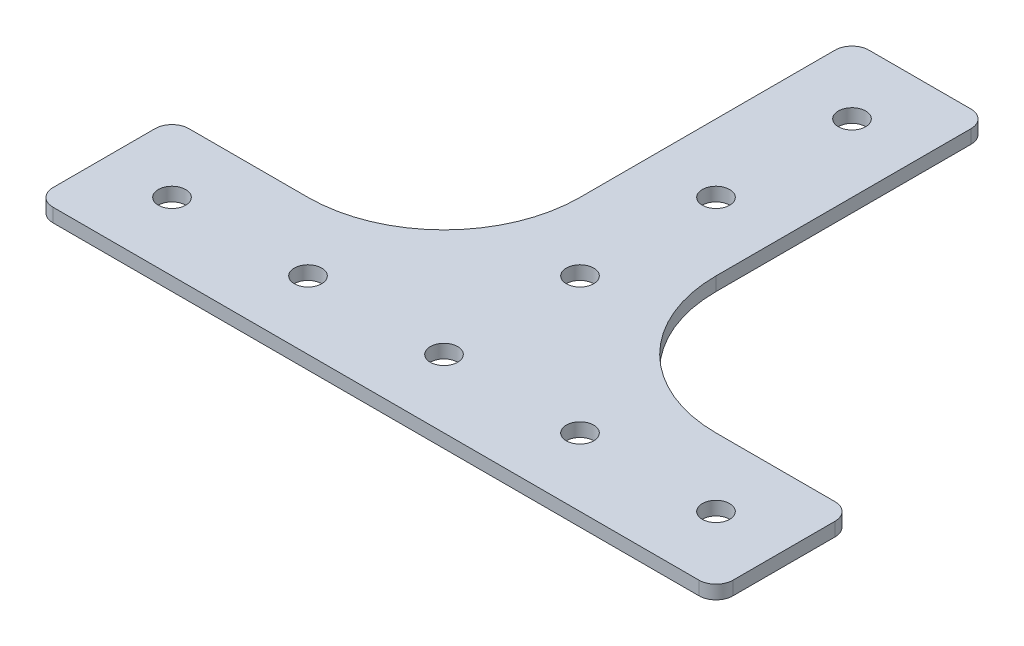
ISO-10303-21;
HEADER;
FILE_DESCRIPTION(('STEP AP214'),'2;1');
FILE_NAME('part.step','',(''),(''),'','','');
FILE_SCHEMA(('AUTOMOTIVE_DESIGN { 1 0 10303 214 1 1 1 1 }'));
ENDSEC;
DATA;
#1=APPLICATION_CONTEXT('core data for automotive mechanical design processes');
#2=APPLICATION_PROTOCOL_DEFINITION('international standard','automotive_design',2000,#1);
#3=PRODUCT_CONTEXT('',#1,'mechanical');
#4=PRODUCT('Part','Part','',(#3));
#5=PRODUCT_RELATED_PRODUCT_CATEGORY('part','',(#4));
#6=PRODUCT_DEFINITION_FORMATION('','',#4);
#7=PRODUCT_DEFINITION_CONTEXT('part definition',#1,'design');
#8=PRODUCT_DEFINITION('design','',#6,#7);
#9=PRODUCT_DEFINITION_SHAPE('','',#8);
#10=(LENGTH_UNIT() NAMED_UNIT(*) SI_UNIT(.MILLI.,.METRE.));
#11=(NAMED_UNIT(*) PLANE_ANGLE_UNIT() SI_UNIT($,.RADIAN.));
#12=(NAMED_UNIT(*) SI_UNIT($,.STERADIAN.) SOLID_ANGLE_UNIT());
#13=UNCERTAINTY_MEASURE_WITH_UNIT(LENGTH_MEASURE(1.E-05),#10,'distance_accuracy_value','');
#14=(GEOMETRIC_REPRESENTATION_CONTEXT(3) GLOBAL_UNCERTAINTY_ASSIGNED_CONTEXT((#13)) GLOBAL_UNIT_ASSIGNED_CONTEXT((#10,
#11,#12)) REPRESENTATION_CONTEXT('',''));
#15=CARTESIAN_POINT('',(0.,0.,0.));
#16=DIRECTION('',(0.,0.,1.));
#17=DIRECTION('',(1.,0.,0.));
#18=AXIS2_PLACEMENT_3D('',#15,#16,#17);
#19=CARTESIAN_POINT('',(-12.7,2.54,-25.4));
#20=DIRECTION('',(1.,0.,0.));
#21=DIRECTION('',(0.,0.,-1.));
#22=AXIS2_PLACEMENT_3D('',#19,#20,#21);
#23=PLANE('',#22);
#24=DIRECTION('',(0.,0.,1.));
#25=VECTOR('',#24,1.);
#26=CARTESIAN_POINT('',(-12.7,0.,-25.4));
#27=LINE('',#26,#25);
#28=CARTESIAN_POINT('',(-12.7,0.,-98.425));
#29=VERTEX_POINT('',#28);
#30=CARTESIAN_POINT('',(-12.7,0.,-50.8));
#31=VERTEX_POINT('',#30);
#32=EDGE_CURVE('E357',#29,#31,#27,.T.);
#33=ORIENTED_EDGE('',*,*,#32,.T.);
#34=DIRECTION('',(0.,-1.,0.));
#35=VECTOR('',#34,1.);
#36=CARTESIAN_POINT('',(-12.7,2.54,-50.8));
#37=LINE('',#36,#35);
#38=CARTESIAN_POINT('',(-12.7,2.54,-50.8));
#39=VERTEX_POINT('',#38);
#40=EDGE_CURVE('E267',#31,#39,#37,.F.);
#41=ORIENTED_EDGE('',*,*,#40,.T.);
#42=DIRECTION('',(0.,0.,1.));
#43=VECTOR('',#42,1.);
#44=CARTESIAN_POINT('',(-12.7,2.54,-25.4));
#45=LINE('',#44,#43);
#46=CARTESIAN_POINT('',(-12.7,2.54,-98.425));
#47=VERTEX_POINT('',#46);
#48=EDGE_CURVE('E190',#47,#39,#45,.T.);
#49=ORIENTED_EDGE('',*,*,#48,.F.);
#50=DIRECTION('',(0.,-1.,0.));
#51=VECTOR('',#50,1.);
#52=CARTESIAN_POINT('',(-12.7,2.54,-98.425));
#53=LINE('',#52,#51);
#54=EDGE_CURVE('E241',#47,#29,#53,.T.);
#55=ORIENTED_EDGE('',*,*,#54,.T.);
#56=EDGE_LOOP('',(#33,#41,#49,#55));
#57=FACE_BOUND('',#56,.T.);
#58=ADVANCED_FACE('F41',(#57),#23,.F.);
#59=CARTESIAN_POINT('',(-63.5,2.54,-25.4));
#60=DIRECTION('',(0.,0.,1.));
#61=DIRECTION('',(1.,0.,0.));
#62=AXIS2_PLACEMENT_3D('',#59,#60,#61);
#63=PLANE('',#62);
#64=DIRECTION('',(-1.,0.,0.));
#65=VECTOR('',#64,1.);
#66=CARTESIAN_POINT('',(-63.5,2.54,-25.4));
#67=LINE('',#66,#65);
#68=CARTESIAN_POINT('',(-38.1,2.54,-25.4));
#69=VERTEX_POINT('',#68);
#70=CARTESIAN_POINT('',(-60.325,2.54,-25.4));
#71=VERTEX_POINT('',#70);
#72=EDGE_CURVE('E340',#69,#71,#67,.T.);
#73=ORIENTED_EDGE('',*,*,#72,.F.);
#74=DIRECTION('',(0.,-1.,0.));
#75=VECTOR('',#74,1.);
#76=CARTESIAN_POINT('',(-38.1,0.,-25.4));
#77=LINE('',#76,#75);
#78=CARTESIAN_POINT('',(-38.1,0.,-25.4));
#79=VERTEX_POINT('',#78);
#80=EDGE_CURVE('E263',#69,#79,#77,.T.);
#81=ORIENTED_EDGE('',*,*,#80,.T.);
#82=DIRECTION('',(-1.,0.,0.));
#83=VECTOR('',#82,1.);
#84=CARTESIAN_POINT('',(-63.5,0.,-25.4));
#85=LINE('',#84,#83);
#86=CARTESIAN_POINT('',(-60.325,0.,-25.4));
#87=VERTEX_POINT('',#86);
#88=EDGE_CURVE('E361',#79,#87,#85,.T.);
#89=ORIENTED_EDGE('',*,*,#88,.T.);
#90=DIRECTION('',(0.,-1.,0.));
#91=VECTOR('',#90,1.);
#92=CARTESIAN_POINT('',(-60.325,2.54,-25.4));
#93=LINE('',#92,#91);
#94=EDGE_CURVE('E237',#87,#71,#93,.F.);
#95=ORIENTED_EDGE('',*,*,#94,.T.);
#96=EDGE_LOOP('',(#73,#81,#89,#95));
#97=FACE_BOUND('',#96,.T.);
#98=ADVANCED_FACE('F395',(#97),#63,.F.);
#99=CARTESIAN_POINT('',(-63.5,2.54,0.));
#100=DIRECTION('',(1.,0.,0.));
#101=DIRECTION('',(0.,0.,-1.));
#102=AXIS2_PLACEMENT_3D('',#99,#100,#101);
#103=PLANE('',#102);
#104=DIRECTION('',(0.,0.,1.));
#105=VECTOR('',#104,1.);
#106=CARTESIAN_POINT('',(-63.5,2.54,0.));
#107=LINE('',#106,#105);
#108=CARTESIAN_POINT('',(-63.5,2.54,-22.225));
#109=VERTEX_POINT('',#108);
#110=CARTESIAN_POINT('',(-63.5,2.54,-3.175));
#111=VERTEX_POINT('',#110);
#112=EDGE_CURVE('E335',#109,#111,#107,.T.);
#113=ORIENTED_EDGE('',*,*,#112,.F.);
#114=DIRECTION('',(0.,-1.,0.));
#115=VECTOR('',#114,1.);
#116=CARTESIAN_POINT('',(-63.5,2.54,-22.225));
#117=LINE('',#116,#115);
#118=CARTESIAN_POINT('',(-63.5,0.,-22.225));
#119=VERTEX_POINT('',#118);
#120=EDGE_CURVE('E233',#109,#119,#117,.T.);
#121=ORIENTED_EDGE('',*,*,#120,.T.);
#122=DIRECTION('',(0.,0.,1.));
#123=VECTOR('',#122,1.);
#124=CARTESIAN_POINT('',(-63.5,0.,0.));
#125=LINE('',#124,#123);
#126=CARTESIAN_POINT('',(-63.5,0.,-3.175));
#127=VERTEX_POINT('',#126);
#128=EDGE_CURVE('E364',#119,#127,#125,.T.);
#129=ORIENTED_EDGE('',*,*,#128,.T.);
#130=DIRECTION('',(0.,-1.,0.));
#131=VECTOR('',#130,1.);
#132=CARTESIAN_POINT('',(-63.5,2.54,-3.175));
#133=LINE('',#132,#131);
#134=EDGE_CURVE('E230',#127,#111,#133,.F.);
#135=ORIENTED_EDGE('',*,*,#134,.T.);
#136=EDGE_LOOP('',(#113,#121,#129,#135));
#137=FACE_BOUND('',#136,.T.);
#138=ADVANCED_FACE('F392',(#137),#103,.F.);
#139=CARTESIAN_POINT('',(-63.5,2.54,0.));
#140=DIRECTION('',(0.,0.,-1.));
#141=DIRECTION('',(-1.,0.,0.));
#142=AXIS2_PLACEMENT_3D('',#139,#140,#141);
#143=PLANE('',#142);
#144=DIRECTION('',(1.,0.,0.));
#145=VECTOR('',#144,1.);
#146=CARTESIAN_POINT('',(-63.5,0.,0.));
#147=LINE('',#146,#145);
#148=CARTESIAN_POINT('',(-60.325,0.,0.));
#149=VERTEX_POINT('',#148);
#150=CARTESIAN_POINT('',(60.325,0.,0.));
#151=VERTEX_POINT('',#150);
#152=EDGE_CURVE('E184',#149,#151,#147,.T.);
#153=ORIENTED_EDGE('',*,*,#152,.T.);
#154=DIRECTION('',(0.,-1.,0.));
#155=VECTOR('',#154,1.);
#156=CARTESIAN_POINT('',(60.325,2.54,0.));
#157=LINE('',#156,#155);
#158=CARTESIAN_POINT('',(60.325,2.54,0.));
#159=VERTEX_POINT('',#158);
#160=EDGE_CURVE('E260',#151,#159,#157,.F.);
#161=ORIENTED_EDGE('',*,*,#160,.T.);
#162=DIRECTION('',(1.,0.,0.));
#163=VECTOR('',#162,1.);
#164=CARTESIAN_POINT('',(-63.5,2.54,0.));
#165=LINE('',#164,#163);
#166=CARTESIAN_POINT('',(-60.325,2.54,0.));
#167=VERTEX_POINT('',#166);
#168=EDGE_CURVE('E330',#167,#159,#165,.T.);
#169=ORIENTED_EDGE('',*,*,#168,.F.);
#170=DIRECTION('',(0.,-1.,0.));
#171=VECTOR('',#170,1.);
#172=CARTESIAN_POINT('',(-60.325,2.54,0.));
#173=LINE('',#172,#171);
#174=EDGE_CURVE('E256',#167,#149,#173,.T.);
#175=ORIENTED_EDGE('',*,*,#174,.T.);
#176=EDGE_LOOP('',(#153,#161,#169,#175));
#177=FACE_BOUND('',#176,.T.);
#178=ADVANCED_FACE('F373',(#177),#143,.F.);
#179=CARTESIAN_POINT('',(63.5,2.54,-25.4));
#180=DIRECTION('',(-1.,0.,0.));
#181=DIRECTION('',(0.,0.,1.));
#182=AXIS2_PLACEMENT_3D('',#179,#180,#181);
#183=PLANE('',#182);
#184=DIRECTION('',(0.,0.,-1.));
#185=VECTOR('',#184,1.);
#186=CARTESIAN_POINT('',(63.5,0.,-25.4));
#187=LINE('',#186,#185);
#188=CARTESIAN_POINT('',(63.5,0.,-3.17500000000003));
#189=VERTEX_POINT('',#188);
#190=CARTESIAN_POINT('',(63.5,0.,-22.225));
#191=VERTEX_POINT('',#190);
#192=EDGE_CURVE('E177',#189,#191,#187,.T.);
#193=ORIENTED_EDGE('',*,*,#192,.T.);
#194=DIRECTION('',(0.,-1.,0.));
#195=VECTOR('',#194,1.);
#196=CARTESIAN_POINT('',(63.5,2.54,-22.225));
#197=LINE('',#196,#195);
#198=CARTESIAN_POINT('',(63.5,2.54,-22.225));
#199=VERTEX_POINT('',#198);
#200=EDGE_CURVE('E160',#191,#199,#197,.F.);
#201=ORIENTED_EDGE('',*,*,#200,.T.);
#202=DIRECTION('',(0.,0.,-1.));
#203=VECTOR('',#202,1.);
#204=CARTESIAN_POINT('',(63.5,2.54,-25.4));
#205=LINE('',#204,#203);
#206=CARTESIAN_POINT('',(63.5,2.54,-3.17500000000003));
#207=VERTEX_POINT('',#206);
#208=EDGE_CURVE('E325',#207,#199,#205,.T.);
#209=ORIENTED_EDGE('',*,*,#208,.F.);
#210=DIRECTION('',(0.,-1.,0.));
#211=VECTOR('',#210,1.);
#212=CARTESIAN_POINT('',(63.5,2.54,-3.17500000000003));
#213=LINE('',#212,#211);
#214=EDGE_CURVE('E164',#207,#189,#213,.T.);
#215=ORIENTED_EDGE('',*,*,#214,.T.);
#216=EDGE_LOOP('',(#193,#201,#209,#215));
#217=FACE_BOUND('',#216,.T.);
#218=ADVANCED_FACE('F383',(#217),#183,.F.);
#219=CARTESIAN_POINT('',(12.7,2.54,-25.4));
#220=DIRECTION('',(0.,0.,1.));
#221=DIRECTION('',(1.,0.,0.));
#222=AXIS2_PLACEMENT_3D('',#219,#220,#221);
#223=PLANE('',#222);
#224=DIRECTION('',(-1.,0.,0.));
#225=VECTOR('',#224,1.);
#226=CARTESIAN_POINT('',(12.7,0.,-25.4));
#227=LINE('',#226,#225);
#228=CARTESIAN_POINT('',(60.325,0.,-25.4));
#229=VERTEX_POINT('',#228);
#230=CARTESIAN_POINT('',(38.1,0.,-25.4));
#231=VERTEX_POINT('',#230);
#232=EDGE_CURVE('E168',#229,#231,#227,.T.);
#233=ORIENTED_EDGE('',*,*,#232,.T.);
#234=DIRECTION('',(0.,-1.,0.));
#235=VECTOR('',#234,1.);
#236=CARTESIAN_POINT('',(38.1,2.54,-25.4));
#237=LINE('',#236,#235);
#238=CARTESIAN_POINT('',(38.1,2.54,-25.4));
#239=VERTEX_POINT('',#238);
#240=EDGE_CURVE('E63',#231,#239,#237,.F.);
#241=ORIENTED_EDGE('',*,*,#240,.T.);
#242=DIRECTION('',(-1.,0.,0.));
#243=VECTOR('',#242,1.);
#244=CARTESIAN_POINT('',(12.7,2.54,-25.4));
#245=LINE('',#244,#243);
#246=CARTESIAN_POINT('',(60.325,2.54,-25.4));
#247=VERTEX_POINT('',#246);
#248=EDGE_CURVE('E169',#247,#239,#245,.T.);
#249=ORIENTED_EDGE('',*,*,#248,.F.);
#250=DIRECTION('',(0.,-1.,0.));
#251=VECTOR('',#250,1.);
#252=CARTESIAN_POINT('',(60.325,2.54,-25.4));
#253=LINE('',#252,#251);
#254=EDGE_CURVE('E159',#247,#229,#253,.T.);
#255=ORIENTED_EDGE('',*,*,#254,.T.);
#256=EDGE_LOOP('',(#233,#241,#249,#255));
#257=FACE_BOUND('',#256,.T.);
#258=ADVANCED_FACE('F167',(#257),#223,.F.);
#259=CARTESIAN_POINT('',(12.7,2.54,-101.6));
#260=DIRECTION('',(-1.,0.,0.));
#261=DIRECTION('',(0.,0.,1.));
#262=AXIS2_PLACEMENT_3D('',#259,#260,#261);
#263=PLANE('',#262);
#264=DIRECTION('',(0.,0.,-1.));
#265=VECTOR('',#264,1.);
#266=CARTESIAN_POINT('',(12.7,2.54,-101.6));
#267=LINE('',#266,#265);
#268=CARTESIAN_POINT('',(12.7,2.54,-50.8));
#269=VERTEX_POINT('',#268);
#270=CARTESIAN_POINT('',(12.7,2.54,-98.425));
#271=VERTEX_POINT('',#270);
#272=EDGE_CURVE('E318',#269,#271,#267,.T.);
#273=ORIENTED_EDGE('',*,*,#272,.F.);
#274=DIRECTION('',(0.,-1.,0.));
#275=VECTOR('',#274,1.);
#276=CARTESIAN_POINT('',(12.7,0.,-50.8));
#277=LINE('',#276,#275);
#278=CARTESIAN_POINT('',(12.7,0.,-50.8));
#279=VERTEX_POINT('',#278);
#280=EDGE_CURVE('E270',#269,#279,#277,.T.);
#281=ORIENTED_EDGE('',*,*,#280,.T.);
#282=DIRECTION('',(0.,0.,-1.));
#283=VECTOR('',#282,1.);
#284=CARTESIAN_POINT('',(12.7,0.,-101.6));
#285=LINE('',#284,#283);
#286=CARTESIAN_POINT('',(12.7,0.,-98.425));
#287=VERTEX_POINT('',#286);
#288=EDGE_CURVE('E176',#279,#287,#285,.T.);
#289=ORIENTED_EDGE('',*,*,#288,.T.);
#290=DIRECTION('',(0.,-1.,0.));
#291=VECTOR('',#290,1.);
#292=CARTESIAN_POINT('',(12.7,2.54,-98.425));
#293=LINE('',#292,#291);
#294=EDGE_CURVE('E252',#287,#271,#293,.F.);
#295=ORIENTED_EDGE('',*,*,#294,.T.);
#296=EDGE_LOOP('',(#273,#281,#289,#295));
#297=FACE_BOUND('',#296,.T.);
#298=ADVANCED_FACE('F390',(#297),#263,.F.);
#299=CARTESIAN_POINT('',(-12.7,2.54,-101.6));
#300=DIRECTION('',(0.,0.,1.));
#301=DIRECTION('',(1.,0.,0.));
#302=AXIS2_PLACEMENT_3D('',#299,#300,#301);
#303=PLANE('',#302);
#304=DIRECTION('',(-1.,0.,0.));
#305=VECTOR('',#304,1.);
#306=CARTESIAN_POINT('',(-12.7,0.,-101.6));
#307=LINE('',#306,#305);
#308=CARTESIAN_POINT('',(9.52499999999998,0.,-101.6));
#309=VERTEX_POINT('',#308);
#310=CARTESIAN_POINT('',(-9.52500000000002,0.,-101.6));
#311=VERTEX_POINT('',#310);
#312=EDGE_CURVE('E182',#309,#311,#307,.T.);
#313=ORIENTED_EDGE('',*,*,#312,.T.);
#314=DIRECTION('',(0.,-1.,0.));
#315=VECTOR('',#314,1.);
#316=CARTESIAN_POINT('',(-9.52500000000002,2.54,-101.6));
#317=LINE('',#316,#315);
#318=CARTESIAN_POINT('',(-9.52500000000002,2.54,-101.6));
#319=VERTEX_POINT('',#318);
#320=EDGE_CURVE('E249',#311,#319,#317,.F.);
#321=ORIENTED_EDGE('',*,*,#320,.T.);
#322=DIRECTION('',(-1.,0.,0.));
#323=VECTOR('',#322,1.);
#324=CARTESIAN_POINT('',(-12.7,2.54,-101.6));
#325=LINE('',#324,#323);
#326=CARTESIAN_POINT('',(9.52499999999998,2.54,-101.6));
#327=VERTEX_POINT('',#326);
#328=EDGE_CURVE('E172',#327,#319,#325,.T.);
#329=ORIENTED_EDGE('',*,*,#328,.F.);
#330=DIRECTION('',(0.,-1.,0.));
#331=VECTOR('',#330,1.);
#332=CARTESIAN_POINT('',(9.52499999999998,2.54,-101.6));
#333=LINE('',#332,#331);
#334=EDGE_CURVE('E245',#327,#309,#333,.T.);
#335=ORIENTED_EDGE('',*,*,#334,.T.);
#336=EDGE_LOOP('',(#313,#321,#329,#335));
#337=FACE_BOUND('',#336,.T.);
#338=ADVANCED_FACE('F455',(#337),#303,.F.);
#339=CARTESIAN_POINT('',(0.,2.54,0.));
#340=DIRECTION('',(0.,-1.,0.));
#341=DIRECTION('',(0.,0.,-1.));
#342=AXIS2_PLACEMENT_3D('',#339,#340,#341);
#343=PLANE('',#342);
#344=CARTESIAN_POINT('',(0.,2.54,-12.7));
#345=DIRECTION('',(0.,1.,0.));
#346=DIRECTION('',(0.,0.,1.));
#347=AXIS2_PLACEMENT_3D('',#344,#345,#346);
#348=CIRCLE('',#347,2.55269999999999);
#349=CARTESIAN_POINT('',(0.,2.54,-10.1473));
#350=VERTEX_POINT('',#349);
#351=EDGE_CURVE('E521',#350,#350,#348,.T.);
#352=ORIENTED_EDGE('',*,*,#351,.F.);
#353=EDGE_LOOP('',(#352));
#354=FACE_BOUND('',#353,.T.);
#355=CARTESIAN_POINT('',(25.4,2.54,-12.7));
#356=DIRECTION('',(0.,1.,0.));
#357=DIRECTION('',(0.,0.,1.));
#358=AXIS2_PLACEMENT_3D('',#355,#356,#357);
#359=CIRCLE('',#358,2.55269999999999);
#360=CARTESIAN_POINT('',(25.4,2.54,-10.1473));
#361=VERTEX_POINT('',#360);
#362=EDGE_CURVE('E510',#361,#361,#359,.T.);
#363=ORIENTED_EDGE('',*,*,#362,.F.);
#364=EDGE_LOOP('',(#363));
#365=FACE_BOUND('',#364,.T.);
#366=CARTESIAN_POINT('',(50.8,2.54,-12.7));
#367=DIRECTION('',(0.,1.,0.));
#368=DIRECTION('',(0.,0.,1.));
#369=AXIS2_PLACEMENT_3D('',#366,#367,#368);
#370=CIRCLE('',#369,2.55269999999999);
#371=CARTESIAN_POINT('',(50.8,2.54,-10.1473));
#372=VERTEX_POINT('',#371);
#373=EDGE_CURVE('E518',#372,#372,#370,.T.);
#374=ORIENTED_EDGE('',*,*,#373,.F.);
#375=EDGE_LOOP('',(#374));
#376=FACE_BOUND('',#375,.T.);
#377=CARTESIAN_POINT('',(-25.4,2.54,-12.7));
#378=DIRECTION('',(0.,1.,0.));
#379=DIRECTION('',(0.,0.,1.));
#380=AXIS2_PLACEMENT_3D('',#377,#378,#379);
#381=CIRCLE('',#380,2.55269999999999);
#382=CARTESIAN_POINT('',(-25.4,2.54,-10.1473));
#383=VERTEX_POINT('',#382);
#384=EDGE_CURVE('E532',#383,#383,#381,.T.);
#385=ORIENTED_EDGE('',*,*,#384,.F.);
#386=EDGE_LOOP('',(#385));
#387=FACE_BOUND('',#386,.T.);
#388=CARTESIAN_POINT('',(-50.8,2.54,-12.7));
#389=DIRECTION('',(0.,1.,0.));
#390=DIRECTION('',(0.,0.,1.));
#391=AXIS2_PLACEMENT_3D('',#388,#389,#390);
#392=CIRCLE('',#391,2.55269999999999);
#393=CARTESIAN_POINT('',(-50.8,2.54,-10.1473));
#394=VERTEX_POINT('',#393);
#395=EDGE_CURVE('E540',#394,#394,#392,.T.);
#396=ORIENTED_EDGE('',*,*,#395,.F.);
#397=EDGE_LOOP('',(#396));
#398=FACE_BOUND('',#397,.T.);
#399=CARTESIAN_POINT('',(0.,2.54,-38.1));
#400=DIRECTION('',(0.,1.,0.));
#401=DIRECTION('',(0.,0.,1.));
#402=AXIS2_PLACEMENT_3D('',#399,#400,#401);
#403=CIRCLE('',#402,2.55269999999999);
#404=CARTESIAN_POINT('',(0.,2.54,-35.5473));
#405=VERTEX_POINT('',#404);
#406=EDGE_CURVE('E548',#405,#405,#403,.T.);
#407=ORIENTED_EDGE('',*,*,#406,.F.);
#408=EDGE_LOOP('',(#407));
#409=FACE_BOUND('',#408,.T.);
#410=CARTESIAN_POINT('',(0.,2.54,-63.5));
#411=DIRECTION('',(0.,1.,0.));
#412=DIRECTION('',(0.,0.,1.));
#413=AXIS2_PLACEMENT_3D('',#410,#411,#412);
#414=CIRCLE('',#413,2.55269999999999);
#415=CARTESIAN_POINT('',(0.,2.54,-60.9473));
#416=VERTEX_POINT('',#415);
#417=EDGE_CURVE('E556',#416,#416,#414,.T.);
#418=ORIENTED_EDGE('',*,*,#417,.F.);
#419=EDGE_LOOP('',(#418));
#420=FACE_BOUND('',#419,.T.);
#421=CARTESIAN_POINT('',(0.,2.54,-88.9));
#422=DIRECTION('',(0.,1.,0.));
#423=DIRECTION('',(0.,0.,1.));
#424=AXIS2_PLACEMENT_3D('',#421,#422,#423);
#425=CIRCLE('',#424,2.55269999999999);
#426=CARTESIAN_POINT('',(0.,2.54,-86.3473));
#427=VERTEX_POINT('',#426);
#428=EDGE_CURVE('E563',#427,#427,#425,.T.);
#429=ORIENTED_EDGE('',*,*,#428,.F.);
#430=EDGE_LOOP('',(#429));
#431=FACE_BOUND('',#430,.T.);
#432=ORIENTED_EDGE('',*,*,#208,.T.);
#433=CARTESIAN_POINT('',(60.325,2.54,-22.225));
#434=DIRECTION('',(0.,-1.,0.));
#435=DIRECTION('',(0.,0.,-1.));
#436=AXIS2_PLACEMENT_3D('',#433,#434,#435);
#437=CIRCLE('',#436,3.175);
#438=EDGE_CURVE('E227',#199,#247,#437,.F.);
#439=ORIENTED_EDGE('',*,*,#438,.T.);
#440=ORIENTED_EDGE('',*,*,#248,.T.);
#441=CARTESIAN_POINT('',(38.1,2.54,-50.8));
#442=DIRECTION('',(0.,-1.,0.));
#443=DIRECTION('',(0.,0.,-1.));
#444=AXIS2_PLACEMENT_3D('',#441,#442,#443);
#445=CIRCLE('',#444,25.4);
#446=EDGE_CURVE('E11',#239,#269,#445,.T.);
#447=ORIENTED_EDGE('',*,*,#446,.T.);
#448=ORIENTED_EDGE('',*,*,#272,.T.);
#449=CARTESIAN_POINT('',(9.52499999999998,2.54,-98.425));
#450=DIRECTION('',(0.,-1.,0.));
#451=DIRECTION('',(0.,0.,-1.));
#452=AXIS2_PLACEMENT_3D('',#449,#450,#451);
#453=CIRCLE('',#452,3.175);
#454=EDGE_CURVE('E218',#271,#327,#453,.F.);
#455=ORIENTED_EDGE('',*,*,#454,.T.);
#456=ORIENTED_EDGE('',*,*,#328,.T.);
#457=CARTESIAN_POINT('',(-9.52500000000002,2.54,-98.425));
#458=DIRECTION('',(0.,-1.,0.));
#459=DIRECTION('',(0.,0.,-1.));
#460=AXIS2_PLACEMENT_3D('',#457,#458,#459);
#461=CIRCLE('',#460,3.175);
#462=EDGE_CURVE('E221',#319,#47,#461,.F.);
#463=ORIENTED_EDGE('',*,*,#462,.T.);
#464=ORIENTED_EDGE('',*,*,#48,.T.);
#465=CARTESIAN_POINT('',(-38.1,2.54,-50.8));
#466=DIRECTION('',(0.,-1.,0.));
#467=DIRECTION('',(0.,0.,-1.));
#468=AXIS2_PLACEMENT_3D('',#465,#466,#467);
#469=CIRCLE('',#468,25.4);
#470=EDGE_CURVE('E279',#39,#69,#469,.T.);
#471=ORIENTED_EDGE('',*,*,#470,.T.);
#472=ORIENTED_EDGE('',*,*,#72,.T.);
#473=CARTESIAN_POINT('',(-60.325,2.54,-22.225));
#474=DIRECTION('',(0.,-1.,0.));
#475=DIRECTION('',(0.,0.,-1.));
#476=AXIS2_PLACEMENT_3D('',#473,#474,#475);
#477=CIRCLE('',#476,3.175);
#478=EDGE_CURVE('E224',#71,#109,#477,.F.);
#479=ORIENTED_EDGE('',*,*,#478,.T.);
#480=ORIENTED_EDGE('',*,*,#112,.T.);
#481=CARTESIAN_POINT('',(-60.325,2.54,-3.175));
#482=DIRECTION('',(0.,-1.,0.));
#483=DIRECTION('',(0.,0.,-1.));
#484=AXIS2_PLACEMENT_3D('',#481,#482,#483);
#485=CIRCLE('',#484,3.175);
#486=EDGE_CURVE('E212',#111,#167,#485,.F.);
#487=ORIENTED_EDGE('',*,*,#486,.T.);
#488=ORIENTED_EDGE('',*,*,#168,.T.);
#489=CARTESIAN_POINT('',(60.325,2.54,-3.17500000000003));
#490=DIRECTION('',(0.,-1.,0.));
#491=DIRECTION('',(0.,0.,-1.));
#492=AXIS2_PLACEMENT_3D('',#489,#490,#491);
#493=CIRCLE('',#492,3.175);
#494=EDGE_CURVE('E215',#159,#207,#493,.F.);
#495=ORIENTED_EDGE('',*,*,#494,.T.);
#496=EDGE_LOOP('',(#432,#439,#440,#447,#448,#455,#456,#463,#464,#471,#472,#479,#480,#487,#488,#495));
#497=FACE_BOUND('',#496,.T.);
#498=ADVANCED_FACE('F381',(#354,#365,#376,#387,#398,#409,#420,#431,#497),#343,.F.);
#499=CARTESIAN_POINT('',(0.,0.,0.));
#500=DIRECTION('',(0.,-1.,0.));
#501=DIRECTION('',(0.,0.,-1.));
#502=AXIS2_PLACEMENT_3D('',#499,#500,#501);
#503=PLANE('',#502);
#504=CARTESIAN_POINT('',(0.,0.,-12.7));
#505=DIRECTION('',(0.,1.,0.));
#506=DIRECTION('',(0.,0.,1.));
#507=AXIS2_PLACEMENT_3D('',#504,#505,#506);
#508=CIRCLE('',#507,2.5527);
#509=CARTESIAN_POINT('',(0.,0.,-10.1473));
#510=VERTEX_POINT('',#509);
#511=EDGE_CURVE('E513',#510,#510,#508,.T.);
#512=ORIENTED_EDGE('',*,*,#511,.T.);
#513=EDGE_LOOP('',(#512));
#514=FACE_BOUND('',#513,.T.);
#515=CARTESIAN_POINT('',(25.4,0.,-12.7));
#516=DIRECTION('',(0.,1.,0.));
#517=DIRECTION('',(0.,0.,1.));
#518=AXIS2_PLACEMENT_3D('',#515,#516,#517);
#519=CIRCLE('',#518,2.5527);
#520=CARTESIAN_POINT('',(25.4,0.,-10.1473));
#521=VERTEX_POINT('',#520);
#522=EDGE_CURVE('E507',#521,#521,#519,.T.);
#523=ORIENTED_EDGE('',*,*,#522,.T.);
#524=EDGE_LOOP('',(#523));
#525=FACE_BOUND('',#524,.T.);
#526=CARTESIAN_POINT('',(50.8,0.,-12.7));
#527=DIRECTION('',(0.,1.,0.));
#528=DIRECTION('',(0.,0.,1.));
#529=AXIS2_PLACEMENT_3D('',#526,#527,#528);
#530=CIRCLE('',#529,2.5527);
#531=CARTESIAN_POINT('',(50.8,0.,-10.1473));
#532=VERTEX_POINT('',#531);
#533=EDGE_CURVE('E528',#532,#532,#530,.T.);
#534=ORIENTED_EDGE('',*,*,#533,.T.);
#535=EDGE_LOOP('',(#534));
#536=FACE_BOUND('',#535,.T.);
#537=CARTESIAN_POINT('',(-25.4,0.,-12.7));
#538=DIRECTION('',(0.,1.,0.));
#539=DIRECTION('',(0.,0.,1.));
#540=AXIS2_PLACEMENT_3D('',#537,#538,#539);
#541=CIRCLE('',#540,2.5527);
#542=CARTESIAN_POINT('',(-25.4,0.,-10.1473));
#543=VERTEX_POINT('',#542);
#544=EDGE_CURVE('E536',#543,#543,#541,.T.);
#545=ORIENTED_EDGE('',*,*,#544,.T.);
#546=EDGE_LOOP('',(#545));
#547=FACE_BOUND('',#546,.T.);
#548=CARTESIAN_POINT('',(-50.8,0.,-12.7));
#549=DIRECTION('',(0.,1.,0.));
#550=DIRECTION('',(0.,0.,1.));
#551=AXIS2_PLACEMENT_3D('',#548,#549,#550);
#552=CIRCLE('',#551,2.5527);
#553=CARTESIAN_POINT('',(-50.8,0.,-10.1473));
#554=VERTEX_POINT('',#553);
#555=EDGE_CURVE('E544',#554,#554,#552,.T.);
#556=ORIENTED_EDGE('',*,*,#555,.T.);
#557=EDGE_LOOP('',(#556));
#558=FACE_BOUND('',#557,.T.);
#559=CARTESIAN_POINT('',(0.,0.,-38.1));
#560=DIRECTION('',(0.,1.,0.));
#561=DIRECTION('',(0.,0.,1.));
#562=AXIS2_PLACEMENT_3D('',#559,#560,#561);
#563=CIRCLE('',#562,2.5527);
#564=CARTESIAN_POINT('',(0.,0.,-35.5473));
#565=VERTEX_POINT('',#564);
#566=EDGE_CURVE('E552',#565,#565,#563,.T.);
#567=ORIENTED_EDGE('',*,*,#566,.T.);
#568=EDGE_LOOP('',(#567));
#569=FACE_BOUND('',#568,.T.);
#570=CARTESIAN_POINT('',(0.,0.,-63.5));
#571=DIRECTION('',(0.,1.,0.));
#572=DIRECTION('',(0.,0.,1.));
#573=AXIS2_PLACEMENT_3D('',#570,#571,#572);
#574=CIRCLE('',#573,2.5527);
#575=CARTESIAN_POINT('',(0.,0.,-60.9473));
#576=VERTEX_POINT('',#575);
#577=EDGE_CURVE('E560',#576,#576,#574,.T.);
#578=ORIENTED_EDGE('',*,*,#577,.T.);
#579=EDGE_LOOP('',(#578));
#580=FACE_BOUND('',#579,.T.);
#581=CARTESIAN_POINT('',(0.,0.,-88.9));
#582=DIRECTION('',(0.,1.,0.));
#583=DIRECTION('',(0.,0.,1.));
#584=AXIS2_PLACEMENT_3D('',#581,#582,#583);
#585=CIRCLE('',#584,2.5527);
#586=CARTESIAN_POINT('',(0.,0.,-86.3473));
#587=VERTEX_POINT('',#586);
#588=EDGE_CURVE('E354',#587,#587,#585,.T.);
#589=ORIENTED_EDGE('',*,*,#588,.T.);
#590=EDGE_LOOP('',(#589));
#591=FACE_BOUND('',#590,.T.);
#592=ORIENTED_EDGE('',*,*,#232,.F.);
#593=CARTESIAN_POINT('',(60.325,0.,-22.225));
#594=DIRECTION('',(0.,-1.,0.));
#595=DIRECTION('',(0.,0.,-1.));
#596=AXIS2_PLACEMENT_3D('',#593,#594,#595);
#597=CIRCLE('',#596,3.175);
#598=EDGE_CURVE('E155',#229,#191,#597,.T.);
#599=ORIENTED_EDGE('',*,*,#598,.T.);
#600=ORIENTED_EDGE('',*,*,#192,.F.);
#601=CARTESIAN_POINT('',(60.325,0.,-3.17500000000003));
#602=DIRECTION('',(0.,-1.,0.));
#603=DIRECTION('',(0.,0.,-1.));
#604=AXIS2_PLACEMENT_3D('',#601,#602,#603);
#605=CIRCLE('',#604,3.175);
#606=EDGE_CURVE('E194',#189,#151,#605,.T.);
#607=ORIENTED_EDGE('',*,*,#606,.T.);
#608=ORIENTED_EDGE('',*,*,#152,.F.);
#609=CARTESIAN_POINT('',(-60.325,0.,-3.175));
#610=DIRECTION('',(0.,-1.,0.));
#611=DIRECTION('',(0.,0.,-1.));
#612=AXIS2_PLACEMENT_3D('',#609,#610,#611);
#613=CIRCLE('',#612,3.175);
#614=EDGE_CURVE('E171',#149,#127,#613,.T.);
#615=ORIENTED_EDGE('',*,*,#614,.T.);
#616=ORIENTED_EDGE('',*,*,#128,.F.);
#617=CARTESIAN_POINT('',(-60.325,0.,-22.225));
#618=DIRECTION('',(0.,-1.,0.));
#619=DIRECTION('',(0.,0.,-1.));
#620=AXIS2_PLACEMENT_3D('',#617,#618,#619);
#621=CIRCLE('',#620,3.175);
#622=EDGE_CURVE('E165',#119,#87,#621,.T.);
#623=ORIENTED_EDGE('',*,*,#622,.T.);
#624=ORIENTED_EDGE('',*,*,#88,.F.);
#625=CARTESIAN_POINT('',(-38.1,0.,-50.8));
#626=DIRECTION('',(0.,-1.,0.));
#627=DIRECTION('',(0.,0.,-1.));
#628=AXIS2_PLACEMENT_3D('',#625,#626,#627);
#629=CIRCLE('',#628,25.4);
#630=EDGE_CURVE('E276',#79,#31,#629,.F.);
#631=ORIENTED_EDGE('',*,*,#630,.T.);
#632=ORIENTED_EDGE('',*,*,#32,.F.);
#633=CARTESIAN_POINT('',(-9.52500000000002,0.,-98.425));
#634=DIRECTION('',(0.,-1.,0.));
#635=DIRECTION('',(0.,0.,-1.));
#636=AXIS2_PLACEMENT_3D('',#633,#634,#635);
#637=CIRCLE('',#636,3.175);
#638=EDGE_CURVE('E201',#29,#311,#637,.T.);
#639=ORIENTED_EDGE('',*,*,#638,.T.);
#640=ORIENTED_EDGE('',*,*,#312,.F.);
#641=CARTESIAN_POINT('',(9.52499999999998,0.,-98.425));
#642=DIRECTION('',(0.,-1.,0.));
#643=DIRECTION('',(0.,0.,-1.));
#644=AXIS2_PLACEMENT_3D('',#641,#642,#643);
#645=CIRCLE('',#644,3.175);
#646=EDGE_CURVE('E197',#309,#287,#645,.T.);
#647=ORIENTED_EDGE('',*,*,#646,.T.);
#648=ORIENTED_EDGE('',*,*,#288,.F.);
#649=CARTESIAN_POINT('',(38.1,0.,-50.8));
#650=DIRECTION('',(0.,-1.,0.));
#651=DIRECTION('',(0.,0.,-1.));
#652=AXIS2_PLACEMENT_3D('',#649,#650,#651);
#653=CIRCLE('',#652,25.4);
#654=EDGE_CURVE('E50',#279,#231,#653,.F.);
#655=ORIENTED_EDGE('',*,*,#654,.T.);
#656=EDGE_LOOP('',(#592,#599,#600,#607,#608,#615,#616,#623,#624,#631,#632,#639,#640,#647,#648,#655));
#657=FACE_BOUND('',#656,.T.);
#658=ADVANCED_FACE('F174',(#514,#525,#536,#547,#558,#569,#580,#591,#657),#503,.T.);
#659=CARTESIAN_POINT('',(60.325,2.54,-22.225));
#660=DIRECTION('',(0.,-1.,0.));
#661=DIRECTION('',(0.,0.,-1.));
#662=AXIS2_PLACEMENT_3D('',#659,#660,#661);
#663=CYLINDRICAL_SURFACE('',#662,3.175);
#664=ORIENTED_EDGE('',*,*,#438,.F.);
#665=ORIENTED_EDGE('',*,*,#200,.F.);
#666=ORIENTED_EDGE('',*,*,#598,.F.);
#667=ORIENTED_EDGE('',*,*,#254,.F.);
#668=EDGE_LOOP('',(#664,#665,#666,#667));
#669=FACE_BOUND('',#668,.T.);
#670=ADVANCED_FACE('F158',(#669),#663,.T.);
#671=CARTESIAN_POINT('',(-60.325,2.54,-22.225));
#672=DIRECTION('',(0.,-1.,0.));
#673=DIRECTION('',(0.,0.,-1.));
#674=AXIS2_PLACEMENT_3D('',#671,#672,#673);
#675=CYLINDRICAL_SURFACE('',#674,3.175);
#676=ORIENTED_EDGE('',*,*,#478,.F.);
#677=ORIENTED_EDGE('',*,*,#94,.F.);
#678=ORIENTED_EDGE('',*,*,#622,.F.);
#679=ORIENTED_EDGE('',*,*,#120,.F.);
#680=EDGE_LOOP('',(#676,#677,#678,#679));
#681=FACE_BOUND('',#680,.T.);
#682=ADVANCED_FACE('F407',(#681),#675,.T.);
#683=CARTESIAN_POINT('',(-9.52500000000002,2.54,-98.425));
#684=DIRECTION('',(0.,-1.,0.));
#685=DIRECTION('',(0.,0.,-1.));
#686=AXIS2_PLACEMENT_3D('',#683,#684,#685);
#687=CYLINDRICAL_SURFACE('',#686,3.175);
#688=ORIENTED_EDGE('',*,*,#462,.F.);
#689=ORIENTED_EDGE('',*,*,#320,.F.);
#690=ORIENTED_EDGE('',*,*,#638,.F.);
#691=ORIENTED_EDGE('',*,*,#54,.F.);
#692=EDGE_LOOP('',(#688,#689,#690,#691));
#693=FACE_BOUND('',#692,.T.);
#694=ADVANCED_FACE('F410',(#693),#687,.T.);
#695=CARTESIAN_POINT('',(9.52499999999998,2.54,-98.425));
#696=DIRECTION('',(0.,-1.,0.));
#697=DIRECTION('',(0.,0.,-1.));
#698=AXIS2_PLACEMENT_3D('',#695,#696,#697);
#699=CYLINDRICAL_SURFACE('',#698,3.175);
#700=ORIENTED_EDGE('',*,*,#454,.F.);
#701=ORIENTED_EDGE('',*,*,#294,.F.);
#702=ORIENTED_EDGE('',*,*,#646,.F.);
#703=ORIENTED_EDGE('',*,*,#334,.F.);
#704=EDGE_LOOP('',(#700,#701,#702,#703));
#705=FACE_BOUND('',#704,.T.);
#706=ADVANCED_FACE('F414',(#705),#699,.T.);
#707=CARTESIAN_POINT('',(60.325,2.54,-3.17500000000003));
#708=DIRECTION('',(0.,-1.,0.));
#709=DIRECTION('',(0.,0.,-1.));
#710=AXIS2_PLACEMENT_3D('',#707,#708,#709);
#711=CYLINDRICAL_SURFACE('',#710,3.175);
#712=ORIENTED_EDGE('',*,*,#494,.F.);
#713=ORIENTED_EDGE('',*,*,#160,.F.);
#714=ORIENTED_EDGE('',*,*,#606,.F.);
#715=ORIENTED_EDGE('',*,*,#214,.F.);
#716=EDGE_LOOP('',(#712,#713,#714,#715));
#717=FACE_BOUND('',#716,.T.);
#718=ADVANCED_FACE('F378',(#717),#711,.T.);
#719=CARTESIAN_POINT('',(-60.325,2.54,-3.175));
#720=DIRECTION('',(0.,-1.,0.));
#721=DIRECTION('',(0.,0.,-1.));
#722=AXIS2_PLACEMENT_3D('',#719,#720,#721);
#723=CYLINDRICAL_SURFACE('',#722,3.175);
#724=ORIENTED_EDGE('',*,*,#486,.F.);
#725=ORIENTED_EDGE('',*,*,#134,.F.);
#726=ORIENTED_EDGE('',*,*,#614,.F.);
#727=ORIENTED_EDGE('',*,*,#174,.F.);
#728=EDGE_LOOP('',(#724,#725,#726,#727));
#729=FACE_BOUND('',#728,.T.);
#730=ADVANCED_FACE('F421',(#729),#723,.T.);
#731=CARTESIAN_POINT('',(0.,2.54,-88.9));
#732=DIRECTION('',(0.,1.,0.));
#733=DIRECTION('',(0.,0.,1.));
#734=AXIS2_PLACEMENT_3D('',#731,#732,#733);
#735=CYLINDRICAL_SURFACE('',#734,2.55269999999999);
#736=ORIENTED_EDGE('',*,*,#588,.F.);
#737=EDGE_LOOP('',(#736));
#738=FACE_BOUND('',#737,.T.);
#739=ORIENTED_EDGE('',*,*,#428,.T.);
#740=EDGE_LOOP('',(#739));
#741=FACE_BOUND('',#740,.T.);
#742=ADVANCED_FACE('F423',(#738,#741),#735,.F.);
#743=CARTESIAN_POINT('',(0.,2.54,-63.5));
#744=DIRECTION('',(0.,1.,0.));
#745=DIRECTION('',(0.,0.,1.));
#746=AXIS2_PLACEMENT_3D('',#743,#744,#745);
#747=CYLINDRICAL_SURFACE('',#746,2.55269999999999);
#748=ORIENTED_EDGE('',*,*,#577,.F.);
#749=EDGE_LOOP('',(#748));
#750=FACE_BOUND('',#749,.T.);
#751=ORIENTED_EDGE('',*,*,#417,.T.);
#752=EDGE_LOOP('',(#751));
#753=FACE_BOUND('',#752,.T.);
#754=ADVANCED_FACE('F479',(#750,#753),#747,.F.);
#755=CARTESIAN_POINT('',(0.,2.54,-38.1));
#756=DIRECTION('',(0.,1.,0.));
#757=DIRECTION('',(0.,0.,1.));
#758=AXIS2_PLACEMENT_3D('',#755,#756,#757);
#759=CYLINDRICAL_SURFACE('',#758,2.55269999999999);
#760=ORIENTED_EDGE('',*,*,#566,.F.);
#761=EDGE_LOOP('',(#760));
#762=FACE_BOUND('',#761,.T.);
#763=ORIENTED_EDGE('',*,*,#406,.T.);
#764=EDGE_LOOP('',(#763));
#765=FACE_BOUND('',#764,.T.);
#766=ADVANCED_FACE('F483',(#762,#765),#759,.F.);
#767=CARTESIAN_POINT('',(-50.8,2.54,-12.7));
#768=DIRECTION('',(0.,1.,0.));
#769=DIRECTION('',(0.,0.,1.));
#770=AXIS2_PLACEMENT_3D('',#767,#768,#769);
#771=CYLINDRICAL_SURFACE('',#770,2.55269999999999);
#772=ORIENTED_EDGE('',*,*,#555,.F.);
#773=EDGE_LOOP('',(#772));
#774=FACE_BOUND('',#773,.T.);
#775=ORIENTED_EDGE('',*,*,#395,.T.);
#776=EDGE_LOOP('',(#775));
#777=FACE_BOUND('',#776,.T.);
#778=ADVANCED_FACE('F487',(#774,#777),#771,.F.);
#779=CARTESIAN_POINT('',(-25.4,2.54,-12.7));
#780=DIRECTION('',(0.,1.,0.));
#781=DIRECTION('',(0.,0.,1.));
#782=AXIS2_PLACEMENT_3D('',#779,#780,#781);
#783=CYLINDRICAL_SURFACE('',#782,2.55269999999999);
#784=ORIENTED_EDGE('',*,*,#544,.F.);
#785=EDGE_LOOP('',(#784));
#786=FACE_BOUND('',#785,.T.);
#787=ORIENTED_EDGE('',*,*,#384,.T.);
#788=EDGE_LOOP('',(#787));
#789=FACE_BOUND('',#788,.T.);
#790=ADVANCED_FACE('F491',(#786,#789),#783,.F.);
#791=CARTESIAN_POINT('',(50.8,2.54,-12.7));
#792=DIRECTION('',(0.,1.,0.));
#793=DIRECTION('',(0.,0.,1.));
#794=AXIS2_PLACEMENT_3D('',#791,#792,#793);
#795=CYLINDRICAL_SURFACE('',#794,2.55269999999999);
#796=ORIENTED_EDGE('',*,*,#533,.F.);
#797=EDGE_LOOP('',(#796));
#798=FACE_BOUND('',#797,.T.);
#799=ORIENTED_EDGE('',*,*,#373,.T.);
#800=EDGE_LOOP('',(#799));
#801=FACE_BOUND('',#800,.T.);
#802=ADVANCED_FACE('F495',(#798,#801),#795,.F.);
#803=CARTESIAN_POINT('',(25.4,2.54,-12.7));
#804=DIRECTION('',(0.,1.,0.));
#805=DIRECTION('',(0.,0.,1.));
#806=AXIS2_PLACEMENT_3D('',#803,#804,#805);
#807=CYLINDRICAL_SURFACE('',#806,2.55269999999999);
#808=ORIENTED_EDGE('',*,*,#522,.F.);
#809=EDGE_LOOP('',(#808));
#810=FACE_BOUND('',#809,.T.);
#811=ORIENTED_EDGE('',*,*,#362,.T.);
#812=EDGE_LOOP('',(#811));
#813=FACE_BOUND('',#812,.T.);
#814=ADVANCED_FACE('F434',(#810,#813),#807,.F.);
#815=CARTESIAN_POINT('',(0.,2.54,-12.7));
#816=DIRECTION('',(0.,1.,0.));
#817=DIRECTION('',(0.,0.,1.));
#818=AXIS2_PLACEMENT_3D('',#815,#816,#817);
#819=CYLINDRICAL_SURFACE('',#818,2.55269999999999);
#820=ORIENTED_EDGE('',*,*,#511,.F.);
#821=EDGE_LOOP('',(#820));
#822=FACE_BOUND('',#821,.T.);
#823=ORIENTED_EDGE('',*,*,#351,.T.);
#824=EDGE_LOOP('',(#823));
#825=FACE_BOUND('',#824,.T.);
#826=ADVANCED_FACE('F427',(#822,#825),#819,.F.);
#827=CARTESIAN_POINT('',(-38.1,2.54,-50.8));
#828=DIRECTION('',(0.,1.,0.));
#829=DIRECTION('',(0.,0.,1.));
#830=AXIS2_PLACEMENT_3D('',#827,#828,#829);
#831=CYLINDRICAL_SURFACE('',#830,25.4);
#832=ORIENTED_EDGE('',*,*,#470,.F.);
#833=ORIENTED_EDGE('',*,*,#40,.F.);
#834=ORIENTED_EDGE('',*,*,#630,.F.);
#835=ORIENTED_EDGE('',*,*,#80,.F.);
#836=EDGE_LOOP('',(#832,#833,#834,#835));
#837=FACE_BOUND('',#836,.T.);
#838=ADVANCED_FACE('F425',(#837),#831,.F.);
#839=CARTESIAN_POINT('',(38.1,2.54,-50.8));
#840=DIRECTION('',(0.,1.,0.));
#841=DIRECTION('',(0.,0.,1.));
#842=AXIS2_PLACEMENT_3D('',#839,#840,#841);
#843=CYLINDRICAL_SURFACE('',#842,25.4);
#844=ORIENTED_EDGE('',*,*,#446,.F.);
#845=ORIENTED_EDGE('',*,*,#240,.F.);
#846=ORIENTED_EDGE('',*,*,#654,.F.);
#847=ORIENTED_EDGE('',*,*,#280,.F.);
#848=EDGE_LOOP('',(#844,#845,#846,#847));
#849=FACE_BOUND('',#848,.T.);
#850=ADVANCED_FACE('F43',(#849),#843,.F.);
#851=CLOSED_SHELL('',(#58,#98,#138,#178,#218,#258,#298,#338,#498,#658,#670,#682,#694,#706,#718,
#730,#742,#754,#766,#778,#790,#802,#814,#826,#838,#850));
#852=MANIFOLD_SOLID_BREP('B2',#851);
#853=ADVANCED_BREP_SHAPE_REPRESENTATION('',(#18,#852),#14);
#854=SHAPE_DEFINITION_REPRESENTATION(#9,#853);
ENDSEC;
END-ISO-10303-21;
